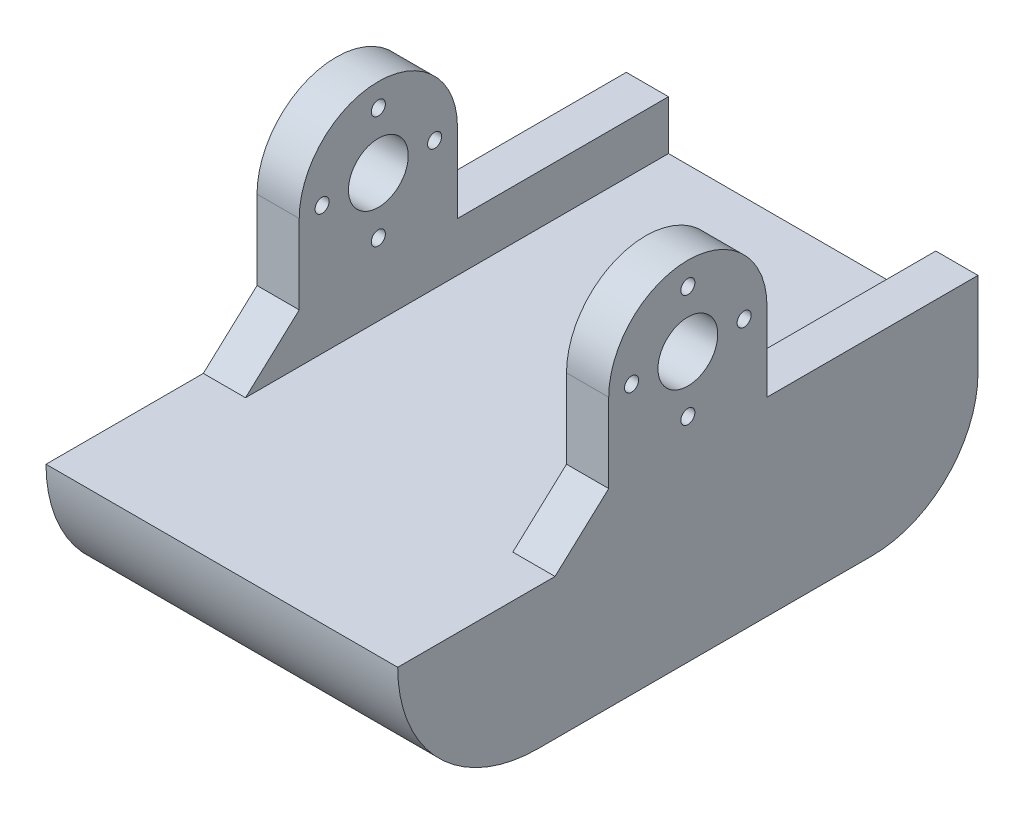
ISO-10303-21;
HEADER;
FILE_DESCRIPTION(('STEP AP214'),'2;1');
FILE_NAME('part.step','',(''),(''),'','','');
FILE_SCHEMA(('AUTOMOTIVE_DESIGN { 1 0 10303 214 1 1 1 1 }'));
ENDSEC;
DATA;
#1=APPLICATION_CONTEXT('core data for automotive mechanical design processes');
#2=APPLICATION_PROTOCOL_DEFINITION('international standard','automotive_design',2000,#1);
#3=PRODUCT_CONTEXT('',#1,'mechanical');
#4=PRODUCT('Part','Part','',(#3));
#5=PRODUCT_RELATED_PRODUCT_CATEGORY('part','',(#4));
#6=PRODUCT_DEFINITION_FORMATION('','',#4);
#7=PRODUCT_DEFINITION_CONTEXT('part definition',#1,'design');
#8=PRODUCT_DEFINITION('design','',#6,#7);
#9=PRODUCT_DEFINITION_SHAPE('','',#8);
#10=(LENGTH_UNIT() NAMED_UNIT(*) SI_UNIT(.MILLI.,.METRE.));
#11=(NAMED_UNIT(*) PLANE_ANGLE_UNIT() SI_UNIT($,.RADIAN.));
#12=(NAMED_UNIT(*) SI_UNIT($,.STERADIAN.) SOLID_ANGLE_UNIT());
#13=UNCERTAINTY_MEASURE_WITH_UNIT(LENGTH_MEASURE(1.E-05),#10,'distance_accuracy_value','');
#14=(GEOMETRIC_REPRESENTATION_CONTEXT(3) GLOBAL_UNCERTAINTY_ASSIGNED_CONTEXT((#13)) GLOBAL_UNIT_ASSIGNED_CONTEXT((#10,
#11,#12)) REPRESENTATION_CONTEXT('',''));
#15=CARTESIAN_POINT('',(0.,0.,0.));
#16=DIRECTION('',(0.,0.,1.));
#17=DIRECTION('',(1.,0.,0.));
#18=AXIS2_PLACEMENT_3D('',#15,#16,#17);
#19=CARTESIAN_POINT('',(-25.0000000000001,-21.1358490566038,-19.3745283018868));
#20=DIRECTION('',(0.,0.737154140200741,0.675724628517347));
#21=DIRECTION('',(0.,-0.675724628517347,0.737154140200741));
#22=AXIS2_PLACEMENT_3D('',#19,#20,#21);
#23=PLANE('',#22);
#24=DIRECTION('',(1.,0.,0.));
#25=VECTOR('',#24,1.);
#26=CARTESIAN_POINT('',(-25.,-31.,-8.61363636363637));
#27=LINE('',#26,#25);
#28=CARTESIAN_POINT('',(19.,-31.,-8.61363636363637));
#29=VERTEX_POINT('',#28);
#30=CARTESIAN_POINT('',(25.,-31.,-8.61363636363637));
#31=VERTEX_POINT('',#30);
#32=EDGE_CURVE('E431',#29,#31,#27,.T.);
#33=ORIENTED_EDGE('',*,*,#32,.T.);
#34=DIRECTION('',(0.,-0.675724628517347,0.737154140200741));
#35=VECTOR('',#34,1.);
#36=CARTESIAN_POINT('',(25.,-21.1358490566038,-19.3745283018868));
#37=LINE('',#36,#35);
#38=CARTESIAN_POINT('',(25.,-24.,-16.25));
#39=VERTEX_POINT('',#38);
#40=EDGE_CURVE('E414',#39,#31,#37,.T.);
#41=ORIENTED_EDGE('',*,*,#40,.F.);
#42=DIRECTION('',(1.,0.,0.));
#43=VECTOR('',#42,1.);
#44=CARTESIAN_POINT('',(-25.0000000000001,-24.,-16.25));
#45=LINE('',#44,#43);
#46=CARTESIAN_POINT('',(19.,-24.,-16.25));
#47=VERTEX_POINT('',#46);
#48=EDGE_CURVE('E333',#47,#39,#45,.T.);
#49=ORIENTED_EDGE('',*,*,#48,.F.);
#50=DIRECTION('',(0.,-0.675724628517347,0.737154140200741));
#51=VECTOR('',#50,1.);
#52=CARTESIAN_POINT('',(19.,6.26037735849058,-49.261320754717));
#53=LINE('',#52,#51);
#54=EDGE_CURVE('E407',#47,#29,#53,.T.);
#55=ORIENTED_EDGE('',*,*,#54,.T.);
#56=EDGE_LOOP('',(#33,#41,#49,#55));
#57=FACE_BOUND('',#56,.T.);
#58=ADVANCED_FACE('F46',(#57),#23,.T.);
#59=CARTESIAN_POINT('',(-19.,0.,-55.));
#60=DIRECTION('',(-1.,0.,0.));
#61=DIRECTION('',(0.,-1.,0.));
#62=AXIS2_PLACEMENT_3D('',#59,#60,#61);
#63=PLANE('',#62);
#64=CARTESIAN_POINT('',(-19.,-12.75,-27.5));
#65=DIRECTION('',(-1.,0.,0.));
#66=DIRECTION('',(0.,-1.,0.));
#67=AXIS2_PLACEMENT_3D('',#64,#65,#66);
#68=CIRCLE('',#67,4.25);
#69=CARTESIAN_POINT('',(-19.,-17.,-27.5));
#70=VERTEX_POINT('',#69);
#71=EDGE_CURVE('E362',#70,#70,#68,.F.);
#72=ORIENTED_EDGE('',*,*,#71,.F.);
#73=EDGE_LOOP('',(#72));
#74=FACE_BOUND('',#73,.T.);
#75=CARTESIAN_POINT('',(-19.,-12.7499999999999,-35.5000000000001));
#76=DIRECTION('',(-1.,0.,0.));
#77=DIRECTION('',(0.,-1.,0.));
#78=AXIS2_PLACEMENT_3D('',#75,#76,#77);
#79=CIRCLE('',#78,1.00000000000001);
#80=CARTESIAN_POINT('',(-19.,-13.7499999999999,-35.5000000000001));
#81=VERTEX_POINT('',#80);
#82=EDGE_CURVE('E354',#81,#81,#79,.F.);
#83=ORIENTED_EDGE('',*,*,#82,.F.);
#84=EDGE_LOOP('',(#83));
#85=FACE_BOUND('',#84,.T.);
#86=CARTESIAN_POINT('',(-19.,-4.75000000000001,-27.5));
#87=DIRECTION('',(-1.,0.,0.));
#88=DIRECTION('',(0.,-1.,0.));
#89=AXIS2_PLACEMENT_3D('',#86,#87,#88);
#90=CIRCLE('',#89,1.);
#91=CARTESIAN_POINT('',(-19.,-5.75000000000001,-27.5));
#92=VERTEX_POINT('',#91);
#93=EDGE_CURVE('E350',#92,#92,#90,.F.);
#94=ORIENTED_EDGE('',*,*,#93,.F.);
#95=EDGE_LOOP('',(#94));
#96=FACE_BOUND('',#95,.T.);
#97=CARTESIAN_POINT('',(-19.,-20.75,-27.5000000000002));
#98=DIRECTION('',(-1.,0.,0.));
#99=DIRECTION('',(0.,-1.,0.));
#100=AXIS2_PLACEMENT_3D('',#97,#98,#99);
#101=CIRCLE('',#100,1.);
#102=CARTESIAN_POINT('',(-19.,-21.75,-27.5000000000002));
#103=VERTEX_POINT('',#102);
#104=EDGE_CURVE('E358',#103,#103,#101,.F.);
#105=ORIENTED_EDGE('',*,*,#104,.F.);
#106=EDGE_LOOP('',(#105));
#107=FACE_BOUND('',#106,.T.);
#108=CARTESIAN_POINT('',(-19.,-12.75,-19.5000000000001));
#109=DIRECTION('',(-1.,0.,0.));
#110=DIRECTION('',(0.,-1.,0.));
#111=AXIS2_PLACEMENT_3D('',#108,#109,#110);
#112=CIRCLE('',#111,1.);
#113=CARTESIAN_POINT('',(-19.,-13.75,-19.5000000000001));
#114=VERTEX_POINT('',#113);
#115=EDGE_CURVE('E366',#114,#114,#112,.F.);
#116=ORIENTED_EDGE('',*,*,#115,.F.);
#117=EDGE_LOOP('',(#116));
#118=FACE_BOUND('',#117,.T.);
#119=DIRECTION('',(0.,0.,1.));
#120=VECTOR('',#119,1.);
#121=CARTESIAN_POINT('',(-19.,-31.,-68.7536363636364));
#122=LINE('',#121,#120);
#123=CARTESIAN_POINT('',(-19.,-31.,-68.75));
#124=VERTEX_POINT('',#123);
#125=CARTESIAN_POINT('',(-19.,-31.,-8.61363636363637));
#126=VERTEX_POINT('',#125);
#127=EDGE_CURVE('E418',#124,#126,#122,.T.);
#128=ORIENTED_EDGE('',*,*,#127,.F.);
#129=DIRECTION('',(0.,1.,0.));
#130=VECTOR('',#129,1.);
#131=CARTESIAN_POINT('',(-19.,0.,-68.75));
#132=LINE('',#131,#130);
#133=CARTESIAN_POINT('',(-19.,-24.,-68.75));
#134=VERTEX_POINT('',#133);
#135=EDGE_CURVE('E439',#124,#134,#132,.T.);
#136=ORIENTED_EDGE('',*,*,#135,.T.);
#137=DIRECTION('',(0.,0.,1.));
#138=VECTOR('',#137,1.);
#139=CARTESIAN_POINT('',(-19.,-24.,-68.75));
#140=LINE('',#139,#138);
#141=CARTESIAN_POINT('',(-19.,-24.,-38.75));
#142=VERTEX_POINT('',#141);
#143=EDGE_CURVE('E177',#134,#142,#140,.T.);
#144=ORIENTED_EDGE('',*,*,#143,.T.);
#145=DIRECTION('',(0.,1.,0.));
#146=VECTOR('',#145,1.);
#147=CARTESIAN_POINT('',(-19.,0.,-38.75));
#148=LINE('',#147,#146);
#149=CARTESIAN_POINT('',(-19.,-12.75,-38.75));
#150=VERTEX_POINT('',#149);
#151=EDGE_CURVE('E327',#142,#150,#148,.T.);
#152=ORIENTED_EDGE('',*,*,#151,.T.);
#153=CARTESIAN_POINT('',(-19.,-12.75,-27.5));
#154=DIRECTION('',(-1.,0.,0.));
#155=DIRECTION('',(0.,-1.,0.));
#156=AXIS2_PLACEMENT_3D('',#153,#154,#155);
#157=CIRCLE('',#156,11.25);
#158=CARTESIAN_POINT('',(-19.,-12.75,-16.25));
#159=VERTEX_POINT('',#158);
#160=EDGE_CURVE('E346',#159,#150,#157,.T.);
#161=ORIENTED_EDGE('',*,*,#160,.F.);
#162=DIRECTION('',(0.,1.,0.));
#163=VECTOR('',#162,1.);
#164=CARTESIAN_POINT('',(-19.,0.,-16.25));
#165=LINE('',#164,#163);
#166=CARTESIAN_POINT('',(-19.,-24.,-16.25));
#167=VERTEX_POINT('',#166);
#168=EDGE_CURVE('E343',#167,#159,#165,.T.);
#169=ORIENTED_EDGE('',*,*,#168,.F.);
#170=DIRECTION('',(0.,0.675724628517347,-0.737154140200741));
#171=VECTOR('',#170,1.);
#172=CARTESIAN_POINT('',(-19.,6.26037735849058,-49.261320754717));
#173=LINE('',#172,#171);
#174=EDGE_CURVE('E402',#126,#167,#173,.T.);
#175=ORIENTED_EDGE('',*,*,#174,.F.);
#176=EDGE_LOOP('',(#128,#136,#144,#152,#161,#169,#175));
#177=FACE_BOUND('',#176,.T.);
#178=ADVANCED_FACE('F395',(#74,#85,#96,#107,#118,#177),#63,.F.);
#179=CARTESIAN_POINT('',(19.,0.,-55.));
#180=DIRECTION('',(1.,0.,0.));
#181=DIRECTION('',(0.,1.,0.));
#182=AXIS2_PLACEMENT_3D('',#179,#180,#181);
#183=PLANE('',#182);
#184=CARTESIAN_POINT('',(19.,-12.75,-27.5));
#185=DIRECTION('',(1.,0.,0.));
#186=DIRECTION('',(0.,1.,0.));
#187=AXIS2_PLACEMENT_3D('',#184,#185,#186);
#188=CIRCLE('',#187,4.25);
#189=CARTESIAN_POINT('',(19.,-8.50000000000001,-27.5));
#190=VERTEX_POINT('',#189);
#191=EDGE_CURVE('E382',#190,#190,#188,.F.);
#192=ORIENTED_EDGE('',*,*,#191,.F.);
#193=EDGE_LOOP('',(#192));
#194=FACE_BOUND('',#193,.T.);
#195=CARTESIAN_POINT('',(19.,-12.7499999999999,-35.5000000000001));
#196=DIRECTION('',(1.,0.,0.));
#197=DIRECTION('',(0.,1.,0.));
#198=AXIS2_PLACEMENT_3D('',#195,#196,#197);
#199=CIRCLE('',#198,1.00000000000001);
#200=CARTESIAN_POINT('',(19.,-11.7499999999999,-35.5000000000001));
#201=VERTEX_POINT('',#200);
#202=EDGE_CURVE('E374',#201,#201,#199,.F.);
#203=ORIENTED_EDGE('',*,*,#202,.F.);
#204=EDGE_LOOP('',(#203));
#205=FACE_BOUND('',#204,.T.);
#206=CARTESIAN_POINT('',(19.,-4.75000000000001,-27.5));
#207=DIRECTION('',(1.,0.,0.));
#208=DIRECTION('',(0.,1.,0.));
#209=AXIS2_PLACEMENT_3D('',#206,#207,#208);
#210=CIRCLE('',#209,1.);
#211=CARTESIAN_POINT('',(19.,-3.75000000000001,-27.5));
#212=VERTEX_POINT('',#211);
#213=EDGE_CURVE('E370',#212,#212,#210,.F.);
#214=ORIENTED_EDGE('',*,*,#213,.F.);
#215=EDGE_LOOP('',(#214));
#216=FACE_BOUND('',#215,.T.);
#217=CARTESIAN_POINT('',(19.,-20.75,-27.5000000000002));
#218=DIRECTION('',(1.,0.,0.));
#219=DIRECTION('',(0.,1.,0.));
#220=AXIS2_PLACEMENT_3D('',#217,#218,#219);
#221=CIRCLE('',#220,1.);
#222=CARTESIAN_POINT('',(19.,-19.75,-27.5000000000002));
#223=VERTEX_POINT('',#222);
#224=EDGE_CURVE('E378',#223,#223,#221,.F.);
#225=ORIENTED_EDGE('',*,*,#224,.F.);
#226=EDGE_LOOP('',(#225));
#227=FACE_BOUND('',#226,.T.);
#228=CARTESIAN_POINT('',(19.,-12.75,-19.5000000000001));
#229=DIRECTION('',(1.,0.,0.));
#230=DIRECTION('',(0.,1.,0.));
#231=AXIS2_PLACEMENT_3D('',#228,#229,#230);
#232=CIRCLE('',#231,1.);
#233=CARTESIAN_POINT('',(19.,-11.75,-19.5000000000001));
#234=VERTEX_POINT('',#233);
#235=EDGE_CURVE('E222',#234,#234,#232,.F.);
#236=ORIENTED_EDGE('',*,*,#235,.F.);
#237=EDGE_LOOP('',(#236));
#238=FACE_BOUND('',#237,.T.);
#239=DIRECTION('',(0.,0.,1.));
#240=VECTOR('',#239,1.);
#241=CARTESIAN_POINT('',(19.,-24.,-68.75));
#242=LINE('',#241,#240);
#243=CARTESIAN_POINT('',(19.,-24.,-68.75));
#244=VERTEX_POINT('',#243);
#245=CARTESIAN_POINT('',(19.,-24.,-38.75));
#246=VERTEX_POINT('',#245);
#247=EDGE_CURVE('E398',#244,#246,#242,.T.);
#248=ORIENTED_EDGE('',*,*,#247,.F.);
#249=DIRECTION('',(0.,-1.,0.));
#250=VECTOR('',#249,1.);
#251=CARTESIAN_POINT('',(19.,0.,-68.75));
#252=LINE('',#251,#250);
#253=CARTESIAN_POINT('',(19.,-31.,-68.75));
#254=VERTEX_POINT('',#253);
#255=EDGE_CURVE('E183',#244,#254,#252,.T.);
#256=ORIENTED_EDGE('',*,*,#255,.T.);
#257=DIRECTION('',(0.,0.,1.));
#258=VECTOR('',#257,1.);
#259=CARTESIAN_POINT('',(19.,-31.,-68.7536363636364));
#260=LINE('',#259,#258);
#261=EDGE_CURVE('E423',#254,#29,#260,.T.);
#262=ORIENTED_EDGE('',*,*,#261,.T.);
#263=ORIENTED_EDGE('',*,*,#54,.F.);
#264=DIRECTION('',(0.,-1.,0.));
#265=VECTOR('',#264,1.);
#266=CARTESIAN_POINT('',(19.,0.,-16.25));
#267=LINE('',#266,#265);
#268=CARTESIAN_POINT('',(19.,-12.75,-16.25));
#269=VERTEX_POINT('',#268);
#270=EDGE_CURVE('E248',#269,#47,#267,.T.);
#271=ORIENTED_EDGE('',*,*,#270,.F.);
#272=CARTESIAN_POINT('',(19.,-12.75,-27.5));
#273=DIRECTION('',(1.,0.,0.));
#274=DIRECTION('',(0.,1.,0.));
#275=AXIS2_PLACEMENT_3D('',#272,#273,#274);
#276=CIRCLE('',#275,11.25);
#277=CARTESIAN_POINT('',(19.,-12.75,-38.75));
#278=VERTEX_POINT('',#277);
#279=EDGE_CURVE('E245',#278,#269,#276,.T.);
#280=ORIENTED_EDGE('',*,*,#279,.F.);
#281=DIRECTION('',(0.,-1.,0.));
#282=VECTOR('',#281,1.);
#283=CARTESIAN_POINT('',(19.,0.,-38.75));
#284=LINE('',#283,#282);
#285=EDGE_CURVE('E199',#278,#246,#284,.T.);
#286=ORIENTED_EDGE('',*,*,#285,.T.);
#287=EDGE_LOOP('',(#248,#256,#262,#263,#271,#280,#286));
#288=FACE_BOUND('',#287,.T.);
#289=ADVANCED_FACE('F392',(#194,#205,#216,#227,#238,#288),#183,.F.);
#290=CARTESIAN_POINT('',(-25.,0.,-55.));
#291=DIRECTION('',(-1.,0.,0.));
#292=DIRECTION('',(0.,-1.,0.));
#293=AXIS2_PLACEMENT_3D('',#290,#291,#292);
#294=PLANE('',#293);
#295=DIRECTION('',(0.,0.,1.));
#296=VECTOR('',#295,1.);
#297=CARTESIAN_POINT('',(-25.0000000000001,-51.,13.75));
#298=LINE('',#297,#296);
#299=CARTESIAN_POINT('',(-25.0000000000001,-51.,-53.75));
#300=VERTEX_POINT('',#299);
#301=CARTESIAN_POINT('',(-25.0000000000001,-51.,-6.25000000000001));
#302=VERTEX_POINT('',#301);
#303=EDGE_CURVE('E275',#300,#302,#298,.T.);
#304=ORIENTED_EDGE('',*,*,#303,.T.);
#305=CARTESIAN_POINT('',(-25.,-31.,-6.25000000000001));
#306=DIRECTION('',(-1.,0.,0.));
#307=DIRECTION('',(0.,-1.,0.));
#308=AXIS2_PLACEMENT_3D('',#305,#306,#307);
#309=CIRCLE('',#308,20.);
#310=CARTESIAN_POINT('',(-25.,-31.,13.75));
#311=VERTEX_POINT('',#310);
#312=EDGE_CURVE('E11',#302,#311,#309,.T.);
#313=ORIENTED_EDGE('',*,*,#312,.T.);
#314=DIRECTION('',(0.,0.,1.));
#315=VECTOR('',#314,1.);
#316=CARTESIAN_POINT('',(-25.,-31.,13.75));
#317=LINE('',#316,#315);
#318=CARTESIAN_POINT('',(-25.0000000000001,-31.,-8.61363636363637));
#319=VERTEX_POINT('',#318);
#320=EDGE_CURVE('E438',#319,#311,#317,.T.);
#321=ORIENTED_EDGE('',*,*,#320,.F.);
#322=DIRECTION('',(0.,-0.675724628517347,0.737154140200741));
#323=VECTOR('',#322,1.);
#324=CARTESIAN_POINT('',(-25.0000000000001,-21.1358490566038,-19.3745283018868));
#325=LINE('',#324,#323);
#326=CARTESIAN_POINT('',(-25.0000000000001,-24.,-16.25));
#327=VERTEX_POINT('',#326);
#328=EDGE_CURVE('E413',#327,#319,#325,.T.);
#329=ORIENTED_EDGE('',*,*,#328,.F.);
#330=DIRECTION('',(0.,-1.,0.));
#331=VECTOR('',#330,1.);
#332=CARTESIAN_POINT('',(-25.0000000000001,0.,-16.25));
#333=LINE('',#332,#331);
#334=CARTESIAN_POINT('',(-25.0000000000001,-12.75,-16.25));
#335=VERTEX_POINT('',#334);
#336=EDGE_CURVE('E304',#335,#327,#333,.T.);
#337=ORIENTED_EDGE('',*,*,#336,.F.);
#338=CARTESIAN_POINT('',(-25.0000000000001,-12.75,-27.5));
#339=DIRECTION('',(1.,0.,0.));
#340=DIRECTION('',(0.,1.,0.));
#341=AXIS2_PLACEMENT_3D('',#338,#339,#340);
#342=CIRCLE('',#341,11.25);
#343=CARTESIAN_POINT('',(-25.0000000000001,-12.75,-38.75));
#344=VERTEX_POINT('',#343);
#345=EDGE_CURVE('E301',#344,#335,#342,.T.);
#346=ORIENTED_EDGE('',*,*,#345,.F.);
#347=DIRECTION('',(0.,-1.,0.));
#348=VECTOR('',#347,1.);
#349=CARTESIAN_POINT('',(-25.0000000000001,0.,-38.75));
#350=LINE('',#349,#348);
#351=CARTESIAN_POINT('',(-25.0000000000001,-24.,-38.75));
#352=VERTEX_POINT('',#351);
#353=EDGE_CURVE('E299',#344,#352,#350,.T.);
#354=ORIENTED_EDGE('',*,*,#353,.T.);
#355=DIRECTION('',(0.,0.,1.));
#356=VECTOR('',#355,1.);
#357=CARTESIAN_POINT('',(-25.,-24.,0.));
#358=LINE('',#357,#356);
#359=CARTESIAN_POINT('',(-25.0000000000001,-24.,-68.75));
#360=VERTEX_POINT('',#359);
#361=EDGE_CURVE('E194',#360,#352,#358,.T.);
#362=ORIENTED_EDGE('',*,*,#361,.F.);
#363=DIRECTION('',(0.,-1.,0.));
#364=VECTOR('',#363,1.);
#365=CARTESIAN_POINT('',(-25.,0.,-68.75));
#366=LINE('',#365,#364);
#367=CARTESIAN_POINT('',(-25.,-36.,-68.75));
#368=VERTEX_POINT('',#367);
#369=EDGE_CURVE('E176',#360,#368,#366,.T.);
#370=ORIENTED_EDGE('',*,*,#369,.T.);
#371=CARTESIAN_POINT('',(-25.,-36.,-53.75));
#372=DIRECTION('',(-1.,0.,0.));
#373=DIRECTION('',(0.,-1.,0.));
#374=AXIS2_PLACEMENT_3D('',#371,#372,#373);
#375=CIRCLE('',#374,15.);
#376=EDGE_CURVE('E265',#368,#300,#375,.T.);
#377=ORIENTED_EDGE('',*,*,#376,.T.);
#378=EDGE_LOOP('',(#304,#313,#321,#329,#337,#346,#354,#362,#370,#377));
#379=FACE_BOUND('',#378,.T.);
#380=CARTESIAN_POINT('',(-25.,-12.75,-19.5000000000001));
#381=DIRECTION('',(1.,0.,0.));
#382=DIRECTION('',(0.,1.,0.));
#383=AXIS2_PLACEMENT_3D('',#380,#381,#382);
#384=CIRCLE('',#383,1.);
#385=CARTESIAN_POINT('',(-25.,-11.75,-19.5000000000001));
#386=VERTEX_POINT('',#385);
#387=EDGE_CURVE('E195',#386,#386,#384,.T.);
#388=ORIENTED_EDGE('',*,*,#387,.T.);
#389=EDGE_LOOP('',(#388));
#390=FACE_BOUND('',#389,.T.);
#391=CARTESIAN_POINT('',(-25.,-12.75,-27.5));
#392=DIRECTION('',(1.,0.,0.));
#393=DIRECTION('',(0.,1.,0.));
#394=AXIS2_PLACEMENT_3D('',#391,#392,#393);
#395=CIRCLE('',#394,4.25);
#396=CARTESIAN_POINT('',(-25.,-8.50000000000001,-27.5));
#397=VERTEX_POINT('',#396);
#398=EDGE_CURVE('E227',#397,#397,#395,.T.);
#399=ORIENTED_EDGE('',*,*,#398,.T.);
#400=EDGE_LOOP('',(#399));
#401=FACE_BOUND('',#400,.T.);
#402=CARTESIAN_POINT('',(-25.,-20.75,-27.5000000000002));
#403=DIRECTION('',(1.,0.,0.));
#404=DIRECTION('',(0.,1.,0.));
#405=AXIS2_PLACEMENT_3D('',#402,#403,#404);
#406=CIRCLE('',#405,1.);
#407=CARTESIAN_POINT('',(-25.,-19.75,-27.5000000000002));
#408=VERTEX_POINT('',#407);
#409=EDGE_CURVE('E235',#408,#408,#406,.T.);
#410=ORIENTED_EDGE('',*,*,#409,.T.);
#411=EDGE_LOOP('',(#410));
#412=FACE_BOUND('',#411,.T.);
#413=CARTESIAN_POINT('',(-25.,-12.7499999999999,-35.5000000000001));
#414=DIRECTION('',(1.,0.,0.));
#415=DIRECTION('',(0.,1.,0.));
#416=AXIS2_PLACEMENT_3D('',#413,#414,#415);
#417=CIRCLE('',#416,1.00000000000001);
#418=CARTESIAN_POINT('',(-25.,-11.7499999999999,-35.5000000000001));
#419=VERTEX_POINT('',#418);
#420=EDGE_CURVE('E206',#419,#419,#417,.T.);
#421=ORIENTED_EDGE('',*,*,#420,.T.);
#422=EDGE_LOOP('',(#421));
#423=FACE_BOUND('',#422,.T.);
#424=CARTESIAN_POINT('',(-25.,-4.75000000000001,-27.5));
#425=DIRECTION('',(1.,0.,0.));
#426=DIRECTION('',(0.,1.,0.));
#427=AXIS2_PLACEMENT_3D('',#424,#425,#426);
#428=CIRCLE('',#427,1.);
#429=CARTESIAN_POINT('',(-25.,-3.75000000000001,-27.5));
#430=VERTEX_POINT('',#429);
#431=EDGE_CURVE('E215',#430,#430,#428,.T.);
#432=ORIENTED_EDGE('',*,*,#431,.T.);
#433=EDGE_LOOP('',(#432));
#434=FACE_BOUND('',#433,.T.);
#435=ADVANCED_FACE('F273',(#379,#390,#401,#412,#423,#434),#294,.T.);
#436=CARTESIAN_POINT('',(25.,0.,-55.));
#437=DIRECTION('',(1.,0.,0.));
#438=DIRECTION('',(0.,1.,0.));
#439=AXIS2_PLACEMENT_3D('',#436,#437,#438);
#440=PLANE('',#439);
#441=DIRECTION('',(0.,0.,1.));
#442=VECTOR('',#441,1.);
#443=CARTESIAN_POINT('',(25.,-31.,13.75));
#444=LINE('',#443,#442);
#445=CARTESIAN_POINT('',(25.,-31.,13.75));
#446=VERTEX_POINT('',#445);
#447=EDGE_CURVE('E435',#31,#446,#444,.T.);
#448=ORIENTED_EDGE('',*,*,#447,.T.);
#449=CARTESIAN_POINT('',(25.,-31.,-6.25000000000001));
#450=DIRECTION('',(1.,0.,0.));
#451=DIRECTION('',(0.,1.,0.));
#452=AXIS2_PLACEMENT_3D('',#449,#450,#451);
#453=CIRCLE('',#452,20.);
#454=CARTESIAN_POINT('',(25.,-51.,-6.25000000000001));
#455=VERTEX_POINT('',#454);
#456=EDGE_CURVE('E69',#446,#455,#453,.T.);
#457=ORIENTED_EDGE('',*,*,#456,.T.);
#458=DIRECTION('',(0.,0.,1.));
#459=VECTOR('',#458,1.);
#460=CARTESIAN_POINT('',(25.,-51.,13.75));
#461=LINE('',#460,#459);
#462=CARTESIAN_POINT('',(25.,-51.,-53.75));
#463=VERTEX_POINT('',#462);
#464=EDGE_CURVE('E282',#463,#455,#461,.T.);
#465=ORIENTED_EDGE('',*,*,#464,.F.);
#466=CARTESIAN_POINT('',(25.,-36.,-53.75));
#467=DIRECTION('',(1.,0.,0.));
#468=DIRECTION('',(0.,1.,0.));
#469=AXIS2_PLACEMENT_3D('',#466,#467,#468);
#470=CIRCLE('',#469,15.);
#471=CARTESIAN_POINT('',(25.,-36.,-68.75));
#472=VERTEX_POINT('',#471);
#473=EDGE_CURVE('E172',#463,#472,#470,.T.);
#474=ORIENTED_EDGE('',*,*,#473,.T.);
#475=DIRECTION('',(0.,-1.,0.));
#476=VECTOR('',#475,1.);
#477=CARTESIAN_POINT('',(25.,0.,-68.75));
#478=LINE('',#477,#476);
#479=CARTESIAN_POINT('',(25.,-24.,-68.75));
#480=VERTEX_POINT('',#479);
#481=EDGE_CURVE('E164',#480,#472,#478,.T.);
#482=ORIENTED_EDGE('',*,*,#481,.F.);
#483=DIRECTION('',(0.,0.,1.));
#484=VECTOR('',#483,1.);
#485=CARTESIAN_POINT('',(25.,-24.,0.));
#486=LINE('',#485,#484);
#487=CARTESIAN_POINT('',(25.,-24.,-38.75));
#488=VERTEX_POINT('',#487);
#489=EDGE_CURVE('E170',#480,#488,#486,.T.);
#490=ORIENTED_EDGE('',*,*,#489,.T.);
#491=DIRECTION('',(0.,-1.,0.));
#492=VECTOR('',#491,1.);
#493=CARTESIAN_POINT('',(25.,0.,-38.75));
#494=LINE('',#493,#492);
#495=CARTESIAN_POINT('',(25.,-12.75,-38.75));
#496=VERTEX_POINT('',#495);
#497=EDGE_CURVE('E317',#496,#488,#494,.T.);
#498=ORIENTED_EDGE('',*,*,#497,.F.);
#499=CARTESIAN_POINT('',(25.,-12.75,-27.5));
#500=DIRECTION('',(1.,0.,0.));
#501=DIRECTION('',(0.,1.,0.));
#502=AXIS2_PLACEMENT_3D('',#499,#500,#501);
#503=CIRCLE('',#502,11.25);
#504=CARTESIAN_POINT('',(25.,-12.75,-16.25));
#505=VERTEX_POINT('',#504);
#506=EDGE_CURVE('E288',#496,#505,#503,.T.);
#507=ORIENTED_EDGE('',*,*,#506,.T.);
#508=DIRECTION('',(0.,-1.,0.));
#509=VECTOR('',#508,1.);
#510=CARTESIAN_POINT('',(25.,0.,-16.25));
#511=LINE('',#510,#509);
#512=EDGE_CURVE('E311',#505,#39,#511,.T.);
#513=ORIENTED_EDGE('',*,*,#512,.T.);
#514=ORIENTED_EDGE('',*,*,#40,.T.);
#515=EDGE_LOOP('',(#448,#457,#465,#474,#482,#490,#498,#507,#513,#514));
#516=FACE_BOUND('',#515,.T.);
#517=CARTESIAN_POINT('',(25.,-12.75,-19.5000000000001));
#518=DIRECTION('',(1.,0.,0.));
#519=DIRECTION('',(0.,1.,0.));
#520=AXIS2_PLACEMENT_3D('',#517,#518,#519);
#521=CIRCLE('',#520,1.);
#522=CARTESIAN_POINT('',(25.,-11.75,-19.5000000000001));
#523=VERTEX_POINT('',#522);
#524=EDGE_CURVE('E202',#523,#523,#521,.T.);
#525=ORIENTED_EDGE('',*,*,#524,.F.);
#526=EDGE_LOOP('',(#525));
#527=FACE_BOUND('',#526,.T.);
#528=CARTESIAN_POINT('',(25.,-12.75,-27.5));
#529=DIRECTION('',(1.,0.,0.));
#530=DIRECTION('',(0.,1.,0.));
#531=AXIS2_PLACEMENT_3D('',#528,#529,#530);
#532=CIRCLE('',#531,4.25);
#533=CARTESIAN_POINT('',(25.,-8.50000000000001,-27.5));
#534=VERTEX_POINT('',#533);
#535=EDGE_CURVE('E231',#534,#534,#532,.T.);
#536=ORIENTED_EDGE('',*,*,#535,.F.);
#537=EDGE_LOOP('',(#536));
#538=FACE_BOUND('',#537,.T.);
#539=CARTESIAN_POINT('',(25.,-20.75,-27.5000000000002));
#540=DIRECTION('',(1.,0.,0.));
#541=DIRECTION('',(0.,1.,0.));
#542=AXIS2_PLACEMENT_3D('',#539,#540,#541);
#543=CIRCLE('',#542,1.);
#544=CARTESIAN_POINT('',(25.,-19.75,-27.5000000000002));
#545=VERTEX_POINT('',#544);
#546=EDGE_CURVE('E210',#545,#545,#543,.T.);
#547=ORIENTED_EDGE('',*,*,#546,.F.);
#548=EDGE_LOOP('',(#547));
#549=FACE_BOUND('',#548,.T.);
#550=CARTESIAN_POINT('',(25.,-12.7499999999999,-35.5000000000001));
#551=DIRECTION('',(1.,0.,0.));
#552=DIRECTION('',(0.,1.,0.));
#553=AXIS2_PLACEMENT_3D('',#550,#551,#552);
#554=CIRCLE('',#553,1.00000000000001);
#555=CARTESIAN_POINT('',(25.,-11.7499999999999,-35.5000000000001));
#556=VERTEX_POINT('',#555);
#557=EDGE_CURVE('E211',#556,#556,#554,.T.);
#558=ORIENTED_EDGE('',*,*,#557,.F.);
#559=EDGE_LOOP('',(#558));
#560=FACE_BOUND('',#559,.T.);
#561=CARTESIAN_POINT('',(25.,-4.75000000000001,-27.5));
#562=DIRECTION('',(1.,0.,0.));
#563=DIRECTION('',(0.,1.,0.));
#564=AXIS2_PLACEMENT_3D('',#561,#562,#563);
#565=CIRCLE('',#564,1.);
#566=CARTESIAN_POINT('',(25.,-3.75,-27.5));
#567=VERTEX_POINT('',#566);
#568=EDGE_CURVE('E219',#567,#567,#565,.T.);
#569=ORIENTED_EDGE('',*,*,#568,.F.);
#570=EDGE_LOOP('',(#569));
#571=FACE_BOUND('',#570,.T.);
#572=ADVANCED_FACE('F166',(#516,#527,#538,#549,#560,#571),#440,.T.);
#573=CARTESIAN_POINT('',(-25.,-24.,0.));
#574=DIRECTION('',(0.,1.,0.));
#575=DIRECTION('',(0.,0.,1.));
#576=AXIS2_PLACEMENT_3D('',#573,#574,#575);
#577=PLANE('',#576);
#578=DIRECTION('',(1.,0.,0.));
#579=VECTOR('',#578,1.);
#580=CARTESIAN_POINT('',(-25.0000000000001,-24.,-68.75));
#581=LINE('',#580,#579);
#582=EDGE_CURVE('E187',#360,#134,#581,.T.);
#583=ORIENTED_EDGE('',*,*,#582,.F.);
#584=ORIENTED_EDGE('',*,*,#361,.T.);
#585=DIRECTION('',(1.,0.,0.));
#586=VECTOR('',#585,1.);
#587=CARTESIAN_POINT('',(-25.0000000000001,-24.,-38.75));
#588=LINE('',#587,#586);
#589=EDGE_CURVE('E334',#352,#142,#588,.T.);
#590=ORIENTED_EDGE('',*,*,#589,.T.);
#591=ORIENTED_EDGE('',*,*,#143,.F.);
#592=EDGE_LOOP('',(#583,#584,#590,#591));
#593=FACE_BOUND('',#592,.T.);
#594=ADVANCED_FACE('F292',(#593),#577,.T.);
#595=CARTESIAN_POINT('',(-25.,-12.75,-19.5000000000001));
#596=DIRECTION('',(1.,0.,0.));
#597=DIRECTION('',(0.,1.,0.));
#598=AXIS2_PLACEMENT_3D('',#595,#596,#597);
#599=CYLINDRICAL_SURFACE('',#598,1.);
#600=ORIENTED_EDGE('',*,*,#235,.T.);
#601=EDGE_LOOP('',(#600));
#602=FACE_BOUND('',#601,.T.);
#603=ORIENTED_EDGE('',*,*,#524,.T.);
#604=EDGE_LOOP('',(#603));
#605=FACE_BOUND('',#604,.T.);
#606=ADVANCED_FACE('F389',(#602,#605),#599,.F.);
#607=CARTESIAN_POINT('',(-25.,-12.75,-27.5));
#608=DIRECTION('',(1.,0.,0.));
#609=DIRECTION('',(0.,1.,0.));
#610=AXIS2_PLACEMENT_3D('',#607,#608,#609);
#611=CYLINDRICAL_SURFACE('',#610,4.25);
#612=ORIENTED_EDGE('',*,*,#191,.T.);
#613=EDGE_LOOP('',(#612));
#614=FACE_BOUND('',#613,.T.);
#615=ORIENTED_EDGE('',*,*,#535,.T.);
#616=EDGE_LOOP('',(#615));
#617=FACE_BOUND('',#616,.T.);
#618=ADVANCED_FACE('F524',(#614,#617),#611,.F.);
#619=CARTESIAN_POINT('',(-25.,-20.75,-27.5000000000002));
#620=DIRECTION('',(1.,0.,0.));
#621=DIRECTION('',(0.,1.,0.));
#622=AXIS2_PLACEMENT_3D('',#619,#620,#621);
#623=CYLINDRICAL_SURFACE('',#622,1.);
#624=ORIENTED_EDGE('',*,*,#224,.T.);
#625=EDGE_LOOP('',(#624));
#626=FACE_BOUND('',#625,.T.);
#627=ORIENTED_EDGE('',*,*,#546,.T.);
#628=EDGE_LOOP('',(#627));
#629=FACE_BOUND('',#628,.T.);
#630=ADVANCED_FACE('F519',(#626,#629),#623,.F.);
#631=CARTESIAN_POINT('',(-25.,-12.7499999999999,-35.5000000000001));
#632=DIRECTION('',(1.,0.,0.));
#633=DIRECTION('',(0.,1.,0.));
#634=AXIS2_PLACEMENT_3D('',#631,#632,#633);
#635=CYLINDRICAL_SURFACE('',#634,1.00000000000001);
#636=ORIENTED_EDGE('',*,*,#202,.T.);
#637=EDGE_LOOP('',(#636));
#638=FACE_BOUND('',#637,.T.);
#639=ORIENTED_EDGE('',*,*,#557,.T.);
#640=EDGE_LOOP('',(#639));
#641=FACE_BOUND('',#640,.T.);
#642=ADVANCED_FACE('F536',(#638,#641),#635,.F.);
#643=CARTESIAN_POINT('',(-25.,-4.75000000000001,-27.5));
#644=DIRECTION('',(1.,0.,0.));
#645=DIRECTION('',(0.,1.,0.));
#646=AXIS2_PLACEMENT_3D('',#643,#644,#645);
#647=CYLINDRICAL_SURFACE('',#646,1.);
#648=ORIENTED_EDGE('',*,*,#213,.T.);
#649=EDGE_LOOP('',(#648));
#650=FACE_BOUND('',#649,.T.);
#651=ORIENTED_EDGE('',*,*,#568,.T.);
#652=EDGE_LOOP('',(#651));
#653=FACE_BOUND('',#652,.T.);
#654=ADVANCED_FACE('F527',(#650,#653),#647,.F.);
#655=ORIENTED_EDGE('',*,*,#115,.T.);
#656=EDGE_LOOP('',(#655));
#657=FACE_BOUND('',#656,.T.);
#658=ORIENTED_EDGE('',*,*,#387,.F.);
#659=EDGE_LOOP('',(#658));
#660=FACE_BOUND('',#659,.T.);
#661=ADVANCED_FACE('F522',(#657,#660),#599,.F.);
#662=ORIENTED_EDGE('',*,*,#71,.T.);
#663=EDGE_LOOP('',(#662));
#664=FACE_BOUND('',#663,.T.);
#665=ORIENTED_EDGE('',*,*,#398,.F.);
#666=EDGE_LOOP('',(#665));
#667=FACE_BOUND('',#666,.T.);
#668=ADVANCED_FACE('F517',(#664,#667),#611,.F.);
#669=ORIENTED_EDGE('',*,*,#104,.T.);
#670=EDGE_LOOP('',(#669));
#671=FACE_BOUND('',#670,.T.);
#672=ORIENTED_EDGE('',*,*,#409,.F.);
#673=EDGE_LOOP('',(#672));
#674=FACE_BOUND('',#673,.T.);
#675=ADVANCED_FACE('F513',(#671,#674),#623,.F.);
#676=ORIENTED_EDGE('',*,*,#82,.T.);
#677=EDGE_LOOP('',(#676));
#678=FACE_BOUND('',#677,.T.);
#679=ORIENTED_EDGE('',*,*,#420,.F.);
#680=EDGE_LOOP('',(#679));
#681=FACE_BOUND('',#680,.T.);
#682=ADVANCED_FACE('F516',(#678,#681),#635,.F.);
#683=ORIENTED_EDGE('',*,*,#93,.T.);
#684=EDGE_LOOP('',(#683));
#685=FACE_BOUND('',#684,.T.);
#686=ORIENTED_EDGE('',*,*,#431,.F.);
#687=EDGE_LOOP('',(#686));
#688=FACE_BOUND('',#687,.T.);
#689=ADVANCED_FACE('F529',(#685,#688),#647,.F.);
#690=EDGE_CURVE('E180',#244,#480,#581,.T.);
#691=ORIENTED_EDGE('',*,*,#690,.F.);
#692=ORIENTED_EDGE('',*,*,#247,.T.);
#693=EDGE_CURVE('E191',#246,#488,#588,.T.);
#694=ORIENTED_EDGE('',*,*,#693,.T.);
#695=ORIENTED_EDGE('',*,*,#489,.F.);
#696=EDGE_LOOP('',(#691,#692,#694,#695));
#697=FACE_BOUND('',#696,.T.);
#698=ADVANCED_FACE('F189',(#697),#577,.T.);
#699=CARTESIAN_POINT('',(-25.0000000000001,0.,-16.25));
#700=DIRECTION('',(0.,0.,1.));
#701=DIRECTION('',(1.,0.,0.));
#702=AXIS2_PLACEMENT_3D('',#699,#700,#701);
#703=PLANE('',#702);
#704=ORIENTED_EDGE('',*,*,#270,.T.);
#705=ORIENTED_EDGE('',*,*,#48,.T.);
#706=ORIENTED_EDGE('',*,*,#512,.F.);
#707=DIRECTION('',(1.,0.,0.));
#708=VECTOR('',#707,1.);
#709=CARTESIAN_POINT('',(-25.0000000000001,-12.75,-16.25));
#710=LINE('',#709,#708);
#711=EDGE_CURVE('E328',#269,#505,#710,.T.);
#712=ORIENTED_EDGE('',*,*,#711,.F.);
#713=EDGE_LOOP('',(#704,#705,#706,#712));
#714=FACE_BOUND('',#713,.T.);
#715=ADVANCED_FACE('F481',(#714),#703,.T.);
#716=CARTESIAN_POINT('',(-25.0000000000001,0.,-38.75));
#717=DIRECTION('',(0.,0.,1.));
#718=DIRECTION('',(1.,0.,0.));
#719=AXIS2_PLACEMENT_3D('',#716,#717,#718);
#720=PLANE('',#719);
#721=DIRECTION('',(1.,0.,0.));
#722=VECTOR('',#721,1.);
#723=CARTESIAN_POINT('',(-25.0000000000001,-12.75,-38.75));
#724=LINE('',#723,#722);
#725=EDGE_CURVE('E309',#278,#496,#724,.T.);
#726=ORIENTED_EDGE('',*,*,#725,.T.);
#727=ORIENTED_EDGE('',*,*,#497,.T.);
#728=ORIENTED_EDGE('',*,*,#693,.F.);
#729=ORIENTED_EDGE('',*,*,#285,.F.);
#730=EDGE_LOOP('',(#726,#727,#728,#729));
#731=FACE_BOUND('',#730,.T.);
#732=ADVANCED_FACE('F472',(#731),#720,.F.);
#733=CARTESIAN_POINT('',(-25.0000000000001,-12.75,-27.5));
#734=DIRECTION('',(1.,0.,0.));
#735=DIRECTION('',(0.,1.,0.));
#736=AXIS2_PLACEMENT_3D('',#733,#734,#735);
#737=CYLINDRICAL_SURFACE('',#736,11.25);
#738=ORIENTED_EDGE('',*,*,#279,.T.);
#739=ORIENTED_EDGE('',*,*,#711,.T.);
#740=ORIENTED_EDGE('',*,*,#506,.F.);
#741=ORIENTED_EDGE('',*,*,#725,.F.);
#742=EDGE_LOOP('',(#738,#739,#740,#741));
#743=FACE_BOUND('',#742,.T.);
#744=ADVANCED_FACE('F483',(#743),#737,.T.);
#745=ORIENTED_EDGE('',*,*,#160,.T.);
#746=EDGE_CURVE('E337',#344,#150,#724,.T.);
#747=ORIENTED_EDGE('',*,*,#746,.F.);
#748=ORIENTED_EDGE('',*,*,#345,.T.);
#749=EDGE_CURVE('E323',#335,#159,#710,.T.);
#750=ORIENTED_EDGE('',*,*,#749,.T.);
#751=EDGE_LOOP('',(#745,#747,#748,#750));
#752=FACE_BOUND('',#751,.T.);
#753=ADVANCED_FACE('F466',(#752),#737,.T.);
#754=ORIENTED_EDGE('',*,*,#168,.T.);
#755=ORIENTED_EDGE('',*,*,#749,.F.);
#756=ORIENTED_EDGE('',*,*,#336,.T.);
#757=EDGE_CURVE('E329',#327,#167,#45,.T.);
#758=ORIENTED_EDGE('',*,*,#757,.T.);
#759=EDGE_LOOP('',(#754,#755,#756,#758));
#760=FACE_BOUND('',#759,.T.);
#761=ADVANCED_FACE('F462',(#760),#703,.T.);
#762=ORIENTED_EDGE('',*,*,#589,.F.);
#763=ORIENTED_EDGE('',*,*,#353,.F.);
#764=ORIENTED_EDGE('',*,*,#746,.T.);
#765=ORIENTED_EDGE('',*,*,#151,.F.);
#766=EDGE_LOOP('',(#762,#763,#764,#765));
#767=FACE_BOUND('',#766,.T.);
#768=ADVANCED_FACE('F469',(#767),#720,.F.);
#769=CARTESIAN_POINT('',(-25.,0.,-68.75));
#770=DIRECTION('',(0.,0.,1.));
#771=DIRECTION('',(1.,0.,0.));
#772=AXIS2_PLACEMENT_3D('',#769,#770,#771);
#773=PLANE('',#772);
#774=ORIENTED_EDGE('',*,*,#481,.T.);
#775=DIRECTION('',(1.,0.,0.));
#776=VECTOR('',#775,1.);
#777=CARTESIAN_POINT('',(-25.,-36.,-68.75));
#778=LINE('',#777,#776);
#779=EDGE_CURVE('E262',#472,#368,#778,.F.);
#780=ORIENTED_EDGE('',*,*,#779,.T.);
#781=ORIENTED_EDGE('',*,*,#369,.F.);
#782=ORIENTED_EDGE('',*,*,#582,.T.);
#783=ORIENTED_EDGE('',*,*,#135,.F.);
#784=DIRECTION('',(-1.,0.,0.));
#785=VECTOR('',#784,1.);
#786=CARTESIAN_POINT('',(19.,-31.,-68.75));
#787=LINE('',#786,#785);
#788=EDGE_CURVE('E252',#254,#124,#787,.T.);
#789=ORIENTED_EDGE('',*,*,#788,.F.);
#790=ORIENTED_EDGE('',*,*,#255,.F.);
#791=ORIENTED_EDGE('',*,*,#690,.T.);
#792=EDGE_LOOP('',(#774,#780,#781,#782,#783,#789,#790,#791));
#793=FACE_BOUND('',#792,.T.);
#794=ADVANCED_FACE('F181',(#793),#773,.F.);
#795=EDGE_CURVE('E427',#319,#126,#27,.T.);
#796=ORIENTED_EDGE('',*,*,#795,.T.);
#797=ORIENTED_EDGE('',*,*,#174,.T.);
#798=ORIENTED_EDGE('',*,*,#757,.F.);
#799=ORIENTED_EDGE('',*,*,#328,.T.);
#800=EDGE_LOOP('',(#796,#797,#798,#799));
#801=FACE_BOUND('',#800,.T.);
#802=ADVANCED_FACE('F459',(#801),#23,.T.);
#803=CARTESIAN_POINT('',(19.,-31.,-68.7536363636364));
#804=DIRECTION('',(0.,-1.,0.));
#805=DIRECTION('',(0.,0.,-1.));
#806=AXIS2_PLACEMENT_3D('',#803,#804,#805);
#807=PLANE('',#806);
#808=ORIENTED_EDGE('',*,*,#261,.F.);
#809=ORIENTED_EDGE('',*,*,#788,.T.);
#810=ORIENTED_EDGE('',*,*,#127,.T.);
#811=ORIENTED_EDGE('',*,*,#795,.F.);
#812=ORIENTED_EDGE('',*,*,#320,.T.);
#813=DIRECTION('',(1.,0.,0.));
#814=VECTOR('',#813,1.);
#815=CARTESIAN_POINT('',(-25.,-31.,13.75));
#816=LINE('',#815,#814);
#817=EDGE_CURVE('E426',#311,#446,#816,.T.);
#818=ORIENTED_EDGE('',*,*,#817,.T.);
#819=ORIENTED_EDGE('',*,*,#447,.F.);
#820=ORIENTED_EDGE('',*,*,#32,.F.);
#821=EDGE_LOOP('',(#808,#809,#810,#811,#812,#818,#819,#820));
#822=FACE_BOUND('',#821,.T.);
#823=ADVANCED_FACE('F454',(#822),#807,.F.);
#824=CARTESIAN_POINT('',(-25.0000000000001,-51.,13.75));
#825=DIRECTION('',(0.,1.,0.));
#826=DIRECTION('',(-1.,0.,0.));
#827=AXIS2_PLACEMENT_3D('',#824,#825,#826);
#828=PLANE('',#827);
#829=ORIENTED_EDGE('',*,*,#464,.T.);
#830=DIRECTION('',(1.,0.,0.));
#831=VECTOR('',#830,1.);
#832=CARTESIAN_POINT('',(-25.0000000000001,-51.,-6.25000000000001));
#833=LINE('',#832,#831);
#834=EDGE_CURVE('E55',#455,#302,#833,.F.);
#835=ORIENTED_EDGE('',*,*,#834,.T.);
#836=ORIENTED_EDGE('',*,*,#303,.F.);
#837=DIRECTION('',(1.,0.,0.));
#838=VECTOR('',#837,1.);
#839=CARTESIAN_POINT('',(-25.0000000000001,-51.,-53.75));
#840=LINE('',#839,#838);
#841=EDGE_CURVE('E256',#300,#463,#840,.T.);
#842=ORIENTED_EDGE('',*,*,#841,.T.);
#843=EDGE_LOOP('',(#829,#835,#836,#842));
#844=FACE_BOUND('',#843,.T.);
#845=ADVANCED_FACE('F280',(#844),#828,.F.);
#846=CARTESIAN_POINT('',(-25.0000000000001,-36.,-53.75));
#847=DIRECTION('',(1.,0.,0.));
#848=DIRECTION('',(0.,1.,0.));
#849=AXIS2_PLACEMENT_3D('',#846,#847,#848);
#850=CYLINDRICAL_SURFACE('',#849,15.);
#851=ORIENTED_EDGE('',*,*,#376,.F.);
#852=ORIENTED_EDGE('',*,*,#779,.F.);
#853=ORIENTED_EDGE('',*,*,#473,.F.);
#854=ORIENTED_EDGE('',*,*,#841,.F.);
#855=EDGE_LOOP('',(#851,#852,#853,#854));
#856=FACE_BOUND('',#855,.T.);
#857=ADVANCED_FACE('F284',(#856),#850,.T.);
#858=CARTESIAN_POINT('',(-25.,-31.,-6.25000000000001));
#859=DIRECTION('',(-1.,0.,0.));
#860=DIRECTION('',(0.,-1.,0.));
#861=AXIS2_PLACEMENT_3D('',#858,#859,#860);
#862=CYLINDRICAL_SURFACE('',#861,20.);
#863=ORIENTED_EDGE('',*,*,#312,.F.);
#864=ORIENTED_EDGE('',*,*,#834,.F.);
#865=ORIENTED_EDGE('',*,*,#456,.F.);
#866=ORIENTED_EDGE('',*,*,#817,.F.);
#867=EDGE_LOOP('',(#863,#864,#865,#866));
#868=FACE_BOUND('',#867,.T.);
#869=ADVANCED_FACE('F48',(#868),#862,.T.);
#870=CLOSED_SHELL('',(#58,#178,#289,#435,#572,#594,#606,#618,#630,#642,#654,#661,#668,#675,#682,
#689,#698,#715,#732,#744,#753,#761,#768,#794,#802,#823,#845,#857,#869));
#871=MANIFOLD_SOLID_BREP('B2',#870);
#872=ADVANCED_BREP_SHAPE_REPRESENTATION('',(#18,#871),#14);
#873=SHAPE_DEFINITION_REPRESENTATION(#9,#872);
ENDSEC;
END-ISO-10303-21;
